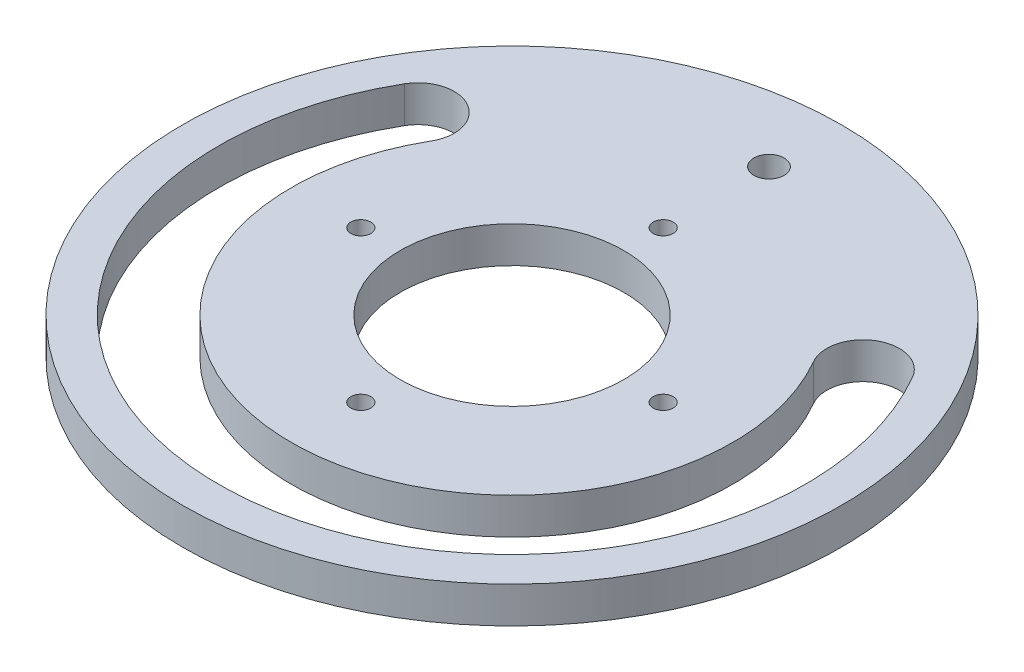
ISO-10303-21;
HEADER;
FILE_DESCRIPTION(('STEP AP214'),'2;1');
FILE_NAME('part.step','',(''),(''),'','','');
FILE_SCHEMA(('AUTOMOTIVE_DESIGN { 1 0 10303 214 1 1 1 1 }'));
ENDSEC;
DATA;
#1=APPLICATION_CONTEXT('core data for automotive mechanical design processes');
#2=APPLICATION_PROTOCOL_DEFINITION('international standard','automotive_design',2000,#1);
#3=PRODUCT_CONTEXT('',#1,'mechanical');
#4=PRODUCT('Part','Part','',(#3));
#5=PRODUCT_RELATED_PRODUCT_CATEGORY('part','',(#4));
#6=PRODUCT_DEFINITION_FORMATION('','',#4);
#7=PRODUCT_DEFINITION_CONTEXT('part definition',#1,'design');
#8=PRODUCT_DEFINITION('design','',#6,#7);
#9=PRODUCT_DEFINITION_SHAPE('','',#8);
#10=(LENGTH_UNIT() NAMED_UNIT(*) SI_UNIT(.MILLI.,.METRE.));
#11=(NAMED_UNIT(*) PLANE_ANGLE_UNIT() SI_UNIT($,.RADIAN.));
#12=(NAMED_UNIT(*) SI_UNIT($,.STERADIAN.) SOLID_ANGLE_UNIT());
#13=UNCERTAINTY_MEASURE_WITH_UNIT(LENGTH_MEASURE(1.E-05),#10,'distance_accuracy_value','');
#14=(GEOMETRIC_REPRESENTATION_CONTEXT(3) GLOBAL_UNCERTAINTY_ASSIGNED_CONTEXT((#13)) GLOBAL_UNIT_ASSIGNED_CONTEXT((#10,
#11,#12)) REPRESENTATION_CONTEXT('',''));
#15=CARTESIAN_POINT('',(0.,0.,0.));
#16=DIRECTION('',(0.,0.,1.));
#17=DIRECTION('',(1.,0.,0.));
#18=AXIS2_PLACEMENT_3D('',#15,#16,#17);
#19=CARTESIAN_POINT('',(0.,6.,0.));
#20=DIRECTION('',(0.,-1.,0.));
#21=DIRECTION('',(0.,0.,-1.));
#22=AXIS2_PLACEMENT_3D('',#19,#20,#21);
#23=CYLINDRICAL_SURFACE('',#22,54.5);
#24=CARTESIAN_POINT('',(0.,6.,0.));
#25=DIRECTION('',(0.,1.,0.));
#26=DIRECTION('',(0.,0.,1.));
#27=AXIS2_PLACEMENT_3D('',#24,#25,#26);
#28=CIRCLE('',#27,54.5);
#29=CARTESIAN_POINT('',(0.,6.,54.5));
#30=VERTEX_POINT('',#29);
#31=EDGE_CURVE('E11',#30,#30,#28,.T.);
#32=ORIENTED_EDGE('',*,*,#31,.F.);
#33=EDGE_LOOP('',(#32));
#34=FACE_BOUND('',#33,.T.);
#35=CARTESIAN_POINT('',(0.,0.,0.));
#36=DIRECTION('',(0.,1.,0.));
#37=DIRECTION('',(0.,0.,1.));
#38=AXIS2_PLACEMENT_3D('',#35,#36,#37);
#39=CIRCLE('',#38,54.5);
#40=CARTESIAN_POINT('',(0.,0.,54.5));
#41=VERTEX_POINT('',#40);
#42=EDGE_CURVE('E36',#41,#41,#39,.T.);
#43=ORIENTED_EDGE('',*,*,#42,.T.);
#44=EDGE_LOOP('',(#43));
#45=FACE_BOUND('',#44,.T.);
#46=ADVANCED_FACE('F33',(#34,#45),#23,.T.);
#47=CARTESIAN_POINT('',(0.,6.,0.));
#48=DIRECTION('',(0.,1.,0.));
#49=DIRECTION('',(0.,0.,1.));
#50=AXIS2_PLACEMENT_3D('',#47,#48,#49);
#51=PLANE('',#50);
#52=CARTESIAN_POINT('',(25.,6.,0.));
#53=DIRECTION('',(0.,1.,0.));
#54=DIRECTION('',(0.,0.,1.));
#55=AXIS2_PLACEMENT_3D('',#52,#53,#54);
#56=CIRCLE('',#55,1.65);
#57=CARTESIAN_POINT('',(25.,6.,1.65));
#58=VERTEX_POINT('',#57);
#59=EDGE_CURVE('E184',#58,#58,#56,.T.);
#60=ORIENTED_EDGE('',*,*,#59,.F.);
#61=EDGE_LOOP('',(#60));
#62=FACE_BOUND('',#61,.T.);
#63=CARTESIAN_POINT('',(0.,6.,25.));
#64=DIRECTION('',(0.,1.,0.));
#65=DIRECTION('',(0.,0.,1.));
#66=AXIS2_PLACEMENT_3D('',#63,#64,#65);
#67=CIRCLE('',#66,1.65);
#68=CARTESIAN_POINT('',(0.,6.,26.65));
#69=VERTEX_POINT('',#68);
#70=EDGE_CURVE('E186',#69,#69,#67,.T.);
#71=ORIENTED_EDGE('',*,*,#70,.F.);
#72=EDGE_LOOP('',(#71));
#73=FACE_BOUND('',#72,.T.);
#74=CARTESIAN_POINT('',(-25.,6.,0.));
#75=DIRECTION('',(0.,1.,0.));
#76=DIRECTION('',(0.,0.,1.));
#77=AXIS2_PLACEMENT_3D('',#74,#75,#76);
#78=CIRCLE('',#77,1.65);
#79=CARTESIAN_POINT('',(-25.,6.,1.65));
#80=VERTEX_POINT('',#79);
#81=EDGE_CURVE('E192',#80,#80,#78,.T.);
#82=ORIENTED_EDGE('',*,*,#81,.F.);
#83=EDGE_LOOP('',(#82));
#84=FACE_BOUND('',#83,.T.);
#85=CARTESIAN_POINT('',(0.,6.,-25.));
#86=DIRECTION('',(0.,1.,0.));
#87=DIRECTION('',(0.,0.,1.));
#88=AXIS2_PLACEMENT_3D('',#85,#86,#87);
#89=CIRCLE('',#88,1.65);
#90=CARTESIAN_POINT('',(0.,6.,-23.35));
#91=VERTEX_POINT('',#90);
#92=EDGE_CURVE('E198',#91,#91,#89,.T.);
#93=ORIENTED_EDGE('',*,*,#92,.F.);
#94=EDGE_LOOP('',(#93));
#95=FACE_BOUND('',#94,.T.);
#96=CARTESIAN_POINT('',(0.,6.,0.));
#97=DIRECTION('',(0.,1.,0.));
#98=DIRECTION('',(0.,0.,1.));
#99=AXIS2_PLACEMENT_3D('',#96,#97,#98);
#100=CIRCLE('',#99,18.5);
#101=CARTESIAN_POINT('',(0.,6.,18.5));
#102=VERTEX_POINT('',#101);
#103=EDGE_CURVE('E204',#102,#102,#100,.T.);
#104=ORIENTED_EDGE('',*,*,#103,.F.);
#105=EDGE_LOOP('',(#104));
#106=FACE_BOUND('',#105,.T.);
#107=CARTESIAN_POINT('',(0.,6.,-42.5));
#108=DIRECTION('',(0.,1.,0.));
#109=DIRECTION('',(0.,0.,1.));
#110=AXIS2_PLACEMENT_3D('',#107,#108,#109);
#111=CIRCLE('',#110,2.5);
#112=CARTESIAN_POINT('',(0.,6.,-40.));
#113=VERTEX_POINT('',#112);
#114=EDGE_CURVE('E97',#113,#113,#111,.T.);
#115=ORIENTED_EDGE('',*,*,#114,.F.);
#116=EDGE_LOOP('',(#115));
#117=FACE_BOUND('',#116,.T.);
#118=CARTESIAN_POINT('',(36.8060796608385,6.,-21.2500000000002));
#119=DIRECTION('',(0.,1.,0.));
#120=DIRECTION('',(0.,0.,1.));
#121=AXIS2_PLACEMENT_3D('',#118,#119,#120);
#122=CIRCLE('',#121,6.);
#123=CARTESIAN_POINT('',(42.0022320835452,6.,-24.2500000000002));
#124=VERTEX_POINT('',#123);
#125=CARTESIAN_POINT('',(31.6099272381319,6.,-18.2500000000001));
#126=VERTEX_POINT('',#125);
#127=EDGE_CURVE('E47',#124,#126,#122,.T.);
#128=ORIENTED_EDGE('',*,*,#127,.F.);
#129=CARTESIAN_POINT('',(0.,6.,0.));
#130=DIRECTION('',(0.,1.,0.));
#131=DIRECTION('',(0.,0.,1.));
#132=AXIS2_PLACEMENT_3D('',#129,#130,#131);
#133=CIRCLE('',#132,48.5);
#134=CARTESIAN_POINT('',(-42.0022320835455,6.,-24.2499999999996));
#135=VERTEX_POINT('',#134);
#136=EDGE_CURVE('E91',#135,#124,#133,.T.);
#137=ORIENTED_EDGE('',*,*,#136,.F.);
#138=CARTESIAN_POINT('',(-36.8060796608389,6.,-21.2499999999996));
#139=DIRECTION('',(0.,1.,0.));
#140=DIRECTION('',(0.,0.,1.));
#141=AXIS2_PLACEMENT_3D('',#138,#139,#140);
#142=CIRCLE('',#141,6.);
#143=CARTESIAN_POINT('',(-31.6099272381322,6.,-18.2499999999997));
#144=VERTEX_POINT('',#143);
#145=EDGE_CURVE('E94',#144,#135,#142,.T.);
#146=ORIENTED_EDGE('',*,*,#145,.F.);
#147=CARTESIAN_POINT('',(0.,6.,0.));
#148=DIRECTION('',(0.,-1.,0.));
#149=DIRECTION('',(0.,0.,1.));
#150=AXIS2_PLACEMENT_3D('',#147,#148,#149);
#151=CIRCLE('',#150,36.5);
#152=EDGE_CURVE('E103',#126,#144,#151,.T.);
#153=ORIENTED_EDGE('',*,*,#152,.F.);
#154=EDGE_LOOP('',(#128,#137,#146,#153));
#155=FACE_BOUND('',#154,.T.);
#156=ORIENTED_EDGE('',*,*,#31,.T.);
#157=EDGE_LOOP('',(#156));
#158=FACE_BOUND('',#157,.T.);
#159=ADVANCED_FACE('F116',(#62,#73,#84,#95,#106,#117,#155,#158),#51,.T.);
#160=CARTESIAN_POINT('',(0.,0.,0.));
#161=DIRECTION('',(0.,1.,0.));
#162=DIRECTION('',(0.,0.,1.));
#163=AXIS2_PLACEMENT_3D('',#160,#161,#162);
#164=PLANE('',#163);
#165=CARTESIAN_POINT('',(25.,0.,0.));
#166=DIRECTION('',(0.,1.,0.));
#167=DIRECTION('',(0.,0.,1.));
#168=AXIS2_PLACEMENT_3D('',#165,#166,#167);
#169=CIRCLE('',#168,1.65);
#170=CARTESIAN_POINT('',(25.,0.,1.65));
#171=VERTEX_POINT('',#170);
#172=EDGE_CURVE('E181',#171,#171,#169,.T.);
#173=ORIENTED_EDGE('',*,*,#172,.T.);
#174=EDGE_LOOP('',(#173));
#175=FACE_BOUND('',#174,.T.);
#176=CARTESIAN_POINT('',(0.,0.,25.));
#177=DIRECTION('',(0.,1.,0.));
#178=DIRECTION('',(0.,0.,1.));
#179=AXIS2_PLACEMENT_3D('',#176,#177,#178);
#180=CIRCLE('',#179,1.65);
#181=CARTESIAN_POINT('',(0.,0.,26.65));
#182=VERTEX_POINT('',#181);
#183=EDGE_CURVE('E189',#182,#182,#180,.T.);
#184=ORIENTED_EDGE('',*,*,#183,.T.);
#185=EDGE_LOOP('',(#184));
#186=FACE_BOUND('',#185,.T.);
#187=CARTESIAN_POINT('',(-25.,0.,0.));
#188=DIRECTION('',(0.,1.,0.));
#189=DIRECTION('',(0.,0.,1.));
#190=AXIS2_PLACEMENT_3D('',#187,#188,#189);
#191=CIRCLE('',#190,1.65);
#192=CARTESIAN_POINT('',(-25.,0.,1.65));
#193=VERTEX_POINT('',#192);
#194=EDGE_CURVE('E195',#193,#193,#191,.T.);
#195=ORIENTED_EDGE('',*,*,#194,.T.);
#196=EDGE_LOOP('',(#195));
#197=FACE_BOUND('',#196,.T.);
#198=CARTESIAN_POINT('',(0.,0.,-25.));
#199=DIRECTION('',(0.,1.,0.));
#200=DIRECTION('',(0.,0.,1.));
#201=AXIS2_PLACEMENT_3D('',#198,#199,#200);
#202=CIRCLE('',#201,1.65);
#203=CARTESIAN_POINT('',(0.,0.,-23.35));
#204=VERTEX_POINT('',#203);
#205=EDGE_CURVE('E201',#204,#204,#202,.T.);
#206=ORIENTED_EDGE('',*,*,#205,.T.);
#207=EDGE_LOOP('',(#206));
#208=FACE_BOUND('',#207,.T.);
#209=CARTESIAN_POINT('',(0.,0.,0.));
#210=DIRECTION('',(0.,1.,0.));
#211=DIRECTION('',(0.,0.,1.));
#212=AXIS2_PLACEMENT_3D('',#209,#210,#211);
#213=CIRCLE('',#212,18.5);
#214=CARTESIAN_POINT('',(0.,0.,18.5));
#215=VERTEX_POINT('',#214);
#216=EDGE_CURVE('E207',#215,#215,#213,.T.);
#217=ORIENTED_EDGE('',*,*,#216,.T.);
#218=EDGE_LOOP('',(#217));
#219=FACE_BOUND('',#218,.T.);
#220=CARTESIAN_POINT('',(0.,0.,-42.5));
#221=DIRECTION('',(0.,1.,0.));
#222=DIRECTION('',(0.,0.,1.));
#223=AXIS2_PLACEMENT_3D('',#220,#221,#222);
#224=CIRCLE('',#223,2.5);
#225=CARTESIAN_POINT('',(0.,0.,-40.));
#226=VERTEX_POINT('',#225);
#227=EDGE_CURVE('E104',#226,#226,#224,.T.);
#228=ORIENTED_EDGE('',*,*,#227,.T.);
#229=EDGE_LOOP('',(#228));
#230=FACE_BOUND('',#229,.T.);
#231=CARTESIAN_POINT('',(0.,0.,0.));
#232=DIRECTION('',(0.,1.,0.));
#233=DIRECTION('',(0.,0.,1.));
#234=AXIS2_PLACEMENT_3D('',#231,#232,#233);
#235=CIRCLE('',#234,48.5);
#236=CARTESIAN_POINT('',(-42.0022320835455,0.,-24.2499999999996));
#237=VERTEX_POINT('',#236);
#238=CARTESIAN_POINT('',(42.0022320835452,0.,-24.2500000000002));
#239=VERTEX_POINT('',#238);
#240=EDGE_CURVE('E81',#237,#239,#235,.T.);
#241=ORIENTED_EDGE('',*,*,#240,.T.);
#242=CARTESIAN_POINT('',(36.8060796608385,0.,-21.2500000000002));
#243=DIRECTION('',(0.,1.,0.));
#244=DIRECTION('',(0.,0.,1.));
#245=AXIS2_PLACEMENT_3D('',#242,#243,#244);
#246=CIRCLE('',#245,6.);
#247=CARTESIAN_POINT('',(31.6099272381319,0.,-18.2500000000001));
#248=VERTEX_POINT('',#247);
#249=EDGE_CURVE('E75',#239,#248,#246,.T.);
#250=ORIENTED_EDGE('',*,*,#249,.T.);
#251=CARTESIAN_POINT('',(0.,0.,0.));
#252=DIRECTION('',(0.,-1.,0.));
#253=DIRECTION('',(0.,0.,1.));
#254=AXIS2_PLACEMENT_3D('',#251,#252,#253);
#255=CIRCLE('',#254,36.5);
#256=CARTESIAN_POINT('',(-31.6099272381322,0.,-18.2499999999997));
#257=VERTEX_POINT('',#256);
#258=EDGE_CURVE('E84',#248,#257,#255,.T.);
#259=ORIENTED_EDGE('',*,*,#258,.T.);
#260=CARTESIAN_POINT('',(-36.8060796608389,0.,-21.2499999999996));
#261=DIRECTION('',(0.,1.,0.));
#262=DIRECTION('',(0.,0.,1.));
#263=AXIS2_PLACEMENT_3D('',#260,#261,#262);
#264=CIRCLE('',#263,6.);
#265=EDGE_CURVE('E55',#257,#237,#264,.T.);
#266=ORIENTED_EDGE('',*,*,#265,.T.);
#267=EDGE_LOOP('',(#241,#250,#259,#266));
#268=FACE_BOUND('',#267,.T.);
#269=ORIENTED_EDGE('',*,*,#42,.F.);
#270=EDGE_LOOP('',(#269));
#271=FACE_BOUND('',#270,.T.);
#272=ADVANCED_FACE('F88',(#175,#186,#197,#208,#219,#230,#268,#271),#164,.F.);
#273=CARTESIAN_POINT('',(36.8060796608385,0.,-21.2500000000002));
#274=DIRECTION('',(0.,1.,0.));
#275=DIRECTION('',(0.,0.,1.));
#276=AXIS2_PLACEMENT_3D('',#273,#274,#275);
#277=CYLINDRICAL_SURFACE('',#276,6.);
#278=ORIENTED_EDGE('',*,*,#127,.T.);
#279=DIRECTION('',(0.,1.,0.));
#280=VECTOR('',#279,1.);
#281=CARTESIAN_POINT('',(31.6099272381319,0.,-18.2500000000001));
#282=LINE('',#281,#280);
#283=EDGE_CURVE('E71',#248,#126,#282,.T.);
#284=ORIENTED_EDGE('',*,*,#283,.F.);
#285=ORIENTED_EDGE('',*,*,#249,.F.);
#286=DIRECTION('',(0.,1.,0.));
#287=VECTOR('',#286,1.);
#288=CARTESIAN_POINT('',(42.0022320835452,0.,-24.2500000000002));
#289=LINE('',#288,#287);
#290=EDGE_CURVE('E108',#239,#124,#289,.T.);
#291=ORIENTED_EDGE('',*,*,#290,.T.);
#292=EDGE_LOOP('',(#278,#284,#285,#291));
#293=FACE_BOUND('',#292,.T.);
#294=ADVANCED_FACE('F73',(#293),#277,.F.);
#295=CARTESIAN_POINT('',(0.,0.,0.));
#296=DIRECTION('',(0.,1.,0.));
#297=DIRECTION('',(0.,0.,1.));
#298=AXIS2_PLACEMENT_3D('',#295,#296,#297);
#299=CYLINDRICAL_SURFACE('',#298,48.5);
#300=ORIENTED_EDGE('',*,*,#136,.T.);
#301=ORIENTED_EDGE('',*,*,#290,.F.);
#302=ORIENTED_EDGE('',*,*,#240,.F.);
#303=DIRECTION('',(0.,1.,0.));
#304=VECTOR('',#303,1.);
#305=CARTESIAN_POINT('',(-42.0022320835455,0.,-24.2499999999996));
#306=LINE('',#305,#304);
#307=EDGE_CURVE('E110',#237,#135,#306,.T.);
#308=ORIENTED_EDGE('',*,*,#307,.T.);
#309=EDGE_LOOP('',(#300,#301,#302,#308));
#310=FACE_BOUND('',#309,.T.);
#311=ADVANCED_FACE('F119',(#310),#299,.F.);
#312=CARTESIAN_POINT('',(-36.8060796608389,0.,-21.2499999999996));
#313=DIRECTION('',(0.,1.,0.));
#314=DIRECTION('',(0.,0.,1.));
#315=AXIS2_PLACEMENT_3D('',#312,#313,#314);
#316=CYLINDRICAL_SURFACE('',#315,6.);
#317=ORIENTED_EDGE('',*,*,#145,.T.);
#318=ORIENTED_EDGE('',*,*,#307,.F.);
#319=ORIENTED_EDGE('',*,*,#265,.F.);
#320=DIRECTION('',(0.,1.,0.));
#321=VECTOR('',#320,1.);
#322=CARTESIAN_POINT('',(-31.6099272381322,0.,-18.2499999999997));
#323=LINE('',#322,#321);
#324=EDGE_CURVE('E80',#257,#144,#323,.T.);
#325=ORIENTED_EDGE('',*,*,#324,.T.);
#326=EDGE_LOOP('',(#317,#318,#319,#325));
#327=FACE_BOUND('',#326,.T.);
#328=ADVANCED_FACE('F112',(#327),#316,.F.);
#329=CARTESIAN_POINT('',(0.,0.,0.));
#330=DIRECTION('',(0.,1.,0.));
#331=DIRECTION('',(0.,0.,1.));
#332=AXIS2_PLACEMENT_3D('',#329,#330,#331);
#333=CYLINDRICAL_SURFACE('',#332,36.5);
#334=ORIENTED_EDGE('',*,*,#152,.T.);
#335=ORIENTED_EDGE('',*,*,#324,.F.);
#336=ORIENTED_EDGE('',*,*,#258,.F.);
#337=ORIENTED_EDGE('',*,*,#283,.T.);
#338=EDGE_LOOP('',(#334,#335,#336,#337));
#339=FACE_BOUND('',#338,.T.);
#340=ADVANCED_FACE('F85',(#339),#333,.T.);
#341=CARTESIAN_POINT('',(0.,0.,-42.5));
#342=DIRECTION('',(0.,1.,0.));
#343=DIRECTION('',(0.,0.,1.));
#344=AXIS2_PLACEMENT_3D('',#341,#342,#343);
#345=CYLINDRICAL_SURFACE('',#344,2.5);
#346=ORIENTED_EDGE('',*,*,#227,.F.);
#347=EDGE_LOOP('',(#346));
#348=FACE_BOUND('',#347,.T.);
#349=ORIENTED_EDGE('',*,*,#114,.T.);
#350=EDGE_LOOP('',(#349));
#351=FACE_BOUND('',#350,.T.);
#352=ADVANCED_FACE('F148',(#348,#351),#345,.F.);
#353=CARTESIAN_POINT('',(0.,0.,0.));
#354=DIRECTION('',(0.,1.,0.));
#355=DIRECTION('',(0.,0.,1.));
#356=AXIS2_PLACEMENT_3D('',#353,#354,#355);
#357=CYLINDRICAL_SURFACE('',#356,18.5);
#358=ORIENTED_EDGE('',*,*,#216,.F.);
#359=EDGE_LOOP('',(#358));
#360=FACE_BOUND('',#359,.T.);
#361=ORIENTED_EDGE('',*,*,#103,.T.);
#362=EDGE_LOOP('',(#361));
#363=FACE_BOUND('',#362,.T.);
#364=ADVANCED_FACE('F152',(#360,#363),#357,.F.);
#365=CARTESIAN_POINT('',(0.,0.,-25.));
#366=DIRECTION('',(0.,1.,0.));
#367=DIRECTION('',(0.,0.,1.));
#368=AXIS2_PLACEMENT_3D('',#365,#366,#367);
#369=CYLINDRICAL_SURFACE('',#368,1.65);
#370=ORIENTED_EDGE('',*,*,#205,.F.);
#371=EDGE_LOOP('',(#370));
#372=FACE_BOUND('',#371,.T.);
#373=ORIENTED_EDGE('',*,*,#92,.T.);
#374=EDGE_LOOP('',(#373));
#375=FACE_BOUND('',#374,.T.);
#376=ADVANCED_FACE('F157',(#372,#375),#369,.F.);
#377=CARTESIAN_POINT('',(-25.,0.,0.));
#378=DIRECTION('',(0.,1.,0.));
#379=DIRECTION('',(0.,0.,1.));
#380=AXIS2_PLACEMENT_3D('',#377,#378,#379);
#381=CYLINDRICAL_SURFACE('',#380,1.65);
#382=ORIENTED_EDGE('',*,*,#194,.F.);
#383=EDGE_LOOP('',(#382));
#384=FACE_BOUND('',#383,.T.);
#385=ORIENTED_EDGE('',*,*,#81,.T.);
#386=EDGE_LOOP('',(#385));
#387=FACE_BOUND('',#386,.T.);
#388=ADVANCED_FACE('F165',(#384,#387),#381,.F.);
#389=CARTESIAN_POINT('',(0.,0.,25.));
#390=DIRECTION('',(0.,1.,0.));
#391=DIRECTION('',(0.,0.,1.));
#392=AXIS2_PLACEMENT_3D('',#389,#390,#391);
#393=CYLINDRICAL_SURFACE('',#392,1.65);
#394=ORIENTED_EDGE('',*,*,#183,.F.);
#395=EDGE_LOOP('',(#394));
#396=FACE_BOUND('',#395,.T.);
#397=ORIENTED_EDGE('',*,*,#70,.T.);
#398=EDGE_LOOP('',(#397));
#399=FACE_BOUND('',#398,.T.);
#400=ADVANCED_FACE('F169',(#396,#399),#393,.F.);
#401=CARTESIAN_POINT('',(25.,0.,0.));
#402=DIRECTION('',(0.,1.,0.));
#403=DIRECTION('',(0.,0.,1.));
#404=AXIS2_PLACEMENT_3D('',#401,#402,#403);
#405=CYLINDRICAL_SURFACE('',#404,1.65);
#406=ORIENTED_EDGE('',*,*,#172,.F.);
#407=EDGE_LOOP('',(#406));
#408=FACE_BOUND('',#407,.T.);
#409=ORIENTED_EDGE('',*,*,#59,.T.);
#410=EDGE_LOOP('',(#409));
#411=FACE_BOUND('',#410,.T.);
#412=ADVANCED_FACE('F173',(#408,#411),#405,.F.);
#413=CLOSED_SHELL('',(#46,#159,#272,#294,#311,#328,#340,#352,#364,#376,#388,#400,#412));
#414=MANIFOLD_SOLID_BREP('B2',#413);
#415=ADVANCED_BREP_SHAPE_REPRESENTATION('',(#18,#414),#14);
#416=SHAPE_DEFINITION_REPRESENTATION(#9,#415);
ENDSEC;
END-ISO-10303-21;
